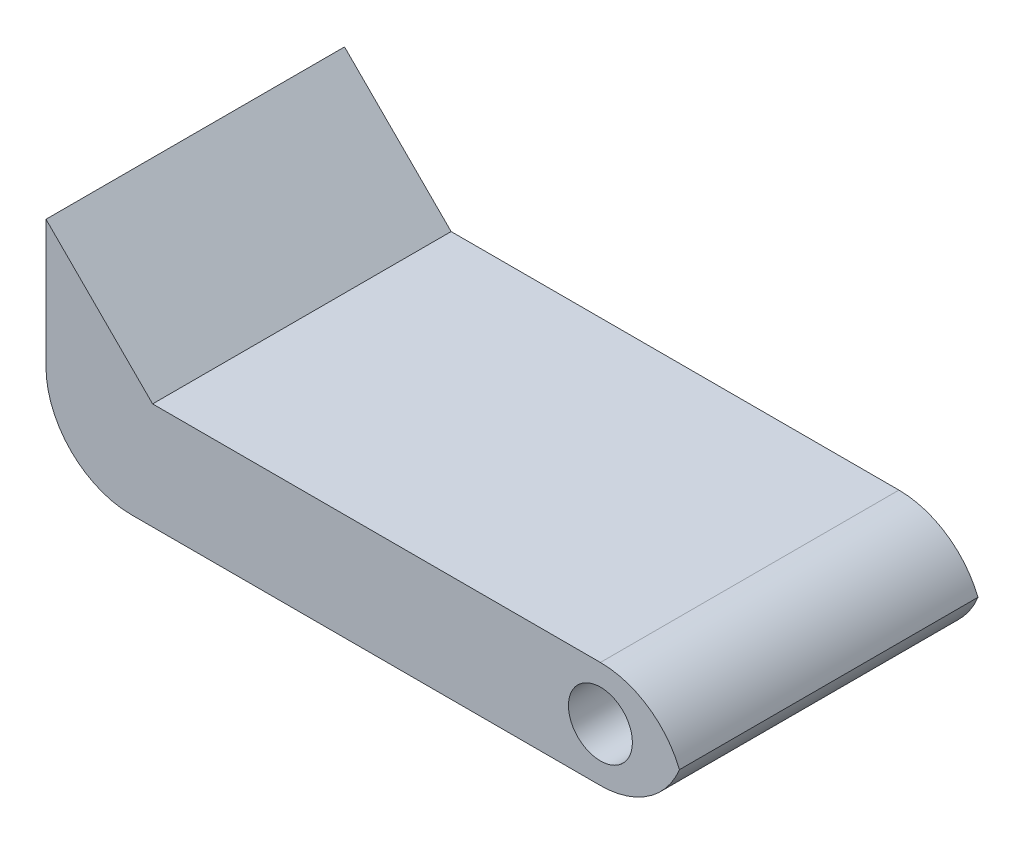
ISO-10303-21;
HEADER;
FILE_DESCRIPTION(('STEP AP214'),'2;1');
FILE_NAME('part.step','',(''),(''),'','','');
FILE_SCHEMA(('AUTOMOTIVE_DESIGN { 1 0 10303 214 1 1 1 1 }'));
ENDSEC;
DATA;
#1=APPLICATION_CONTEXT('core data for automotive mechanical design processes');
#2=APPLICATION_PROTOCOL_DEFINITION('international standard','automotive_design',2000,#1);
#3=PRODUCT_CONTEXT('',#1,'mechanical');
#4=PRODUCT('Part','Part','',(#3));
#5=PRODUCT_RELATED_PRODUCT_CATEGORY('part','',(#4));
#6=PRODUCT_DEFINITION_FORMATION('','',#4);
#7=PRODUCT_DEFINITION_CONTEXT('part definition',#1,'design');
#8=PRODUCT_DEFINITION('design','',#6,#7);
#9=PRODUCT_DEFINITION_SHAPE('','',#8);
#10=(LENGTH_UNIT() NAMED_UNIT(*) SI_UNIT(.MILLI.,.METRE.));
#11=(NAMED_UNIT(*) PLANE_ANGLE_UNIT() SI_UNIT($,.RADIAN.));
#12=(NAMED_UNIT(*) SI_UNIT($,.STERADIAN.) SOLID_ANGLE_UNIT());
#13=UNCERTAINTY_MEASURE_WITH_UNIT(LENGTH_MEASURE(1.E-05),#10,'distance_accuracy_value','');
#14=(GEOMETRIC_REPRESENTATION_CONTEXT(3) GLOBAL_UNCERTAINTY_ASSIGNED_CONTEXT((#13)) GLOBAL_UNIT_ASSIGNED_CONTEXT((#10,
#11,#12)) REPRESENTATION_CONTEXT('',''));
#15=CARTESIAN_POINT('',(0.,0.,0.));
#16=DIRECTION('',(0.,0.,1.));
#17=DIRECTION('',(1.,0.,0.));
#18=AXIS2_PLACEMENT_3D('',#15,#16,#17);
#19=CARTESIAN_POINT('',(0.,0.,17.78));
#20=DIRECTION('',(0.,-1.,0.));
#21=DIRECTION('',(0.,0.,-1.));
#22=AXIS2_PLACEMENT_3D('',#19,#20,#21);
#23=PLANE('',#22);
#24=DIRECTION('',(-1.,0.,0.));
#25=VECTOR('',#24,1.);
#26=CARTESIAN_POINT('',(0.,0.,17.78));
#27=LINE('',#26,#25);
#28=CARTESIAN_POINT('',(-5.08,0.,17.78));
#29=VERTEX_POINT('',#28);
#30=CARTESIAN_POINT('',(-31.75,0.,17.78));
#31=VERTEX_POINT('',#30);
#32=EDGE_CURVE('E103',#29,#31,#27,.T.);
#33=ORIENTED_EDGE('',*,*,#32,.F.);
#34=DIRECTION('',(0.,0.,-1.));
#35=VECTOR('',#34,1.);
#36=CARTESIAN_POINT('',(-5.08,0.,17.78));
#37=LINE('',#36,#35);
#38=CARTESIAN_POINT('',(-5.08,0.,0.));
#39=VERTEX_POINT('',#38);
#40=EDGE_CURVE('E11',#29,#39,#37,.T.);
#41=ORIENTED_EDGE('',*,*,#40,.T.);
#42=DIRECTION('',(-1.,0.,0.));
#43=VECTOR('',#42,1.);
#44=CARTESIAN_POINT('',(0.,0.,0.));
#45=LINE('',#44,#43);
#46=CARTESIAN_POINT('',(-31.75,0.,0.));
#47=VERTEX_POINT('',#46);
#48=EDGE_CURVE('E117',#39,#47,#45,.T.);
#49=ORIENTED_EDGE('',*,*,#48,.T.);
#50=DIRECTION('',(0.,0.,-1.));
#51=VECTOR('',#50,1.);
#52=CARTESIAN_POINT('',(-31.75,0.,17.78));
#53=LINE('',#52,#51);
#54=EDGE_CURVE('E118',#31,#47,#53,.T.);
#55=ORIENTED_EDGE('',*,*,#54,.F.);
#56=EDGE_LOOP('',(#33,#41,#49,#55));
#57=FACE_BOUND('',#56,.T.);
#58=ADVANCED_FACE('F44',(#57),#23,.F.);
#59=CARTESIAN_POINT('',(-31.75,0.,17.78));
#60=DIRECTION('',(-0.707106781186547,-0.707106781186548,0.));
#61=DIRECTION('',(0.707106781186548,-0.707106781186547,0.));
#62=AXIS2_PLACEMENT_3D('',#59,#60,#61);
#63=PLANE('',#62);
#64=DIRECTION('',(-0.707106781186548,0.707106781186547,0.));
#65=VECTOR('',#64,1.);
#66=CARTESIAN_POINT('',(-31.75,0.,0.));
#67=LINE('',#66,#65);
#68=CARTESIAN_POINT('',(-38.1,6.35,0.));
#69=VERTEX_POINT('',#68);
#70=EDGE_CURVE('E139',#47,#69,#67,.T.);
#71=ORIENTED_EDGE('',*,*,#70,.T.);
#72=DIRECTION('',(0.,0.,-1.));
#73=VECTOR('',#72,1.);
#74=CARTESIAN_POINT('',(-38.1,6.35,17.78));
#75=LINE('',#74,#73);
#76=CARTESIAN_POINT('',(-38.1,6.35,17.78));
#77=VERTEX_POINT('',#76);
#78=EDGE_CURVE('E123',#77,#69,#75,.T.);
#79=ORIENTED_EDGE('',*,*,#78,.F.);
#80=DIRECTION('',(-0.707106781186548,0.707106781186547,0.));
#81=VECTOR('',#80,1.);
#82=CARTESIAN_POINT('',(-31.75,0.,17.78));
#83=LINE('',#82,#81);
#84=EDGE_CURVE('E107',#31,#77,#83,.T.);
#85=ORIENTED_EDGE('',*,*,#84,.F.);
#86=ORIENTED_EDGE('',*,*,#54,.T.);
#87=EDGE_LOOP('',(#71,#79,#85,#86));
#88=FACE_BOUND('',#87,.T.);
#89=ADVANCED_FACE('F124',(#88),#63,.F.);
#90=CARTESIAN_POINT('',(-38.1,6.35,17.78));
#91=DIRECTION('',(1.,0.,0.));
#92=DIRECTION('',(0.,0.,-1.));
#93=AXIS2_PLACEMENT_3D('',#90,#91,#92);
#94=PLANE('',#93);
#95=DIRECTION('',(0.,-1.,0.));
#96=VECTOR('',#95,1.);
#97=CARTESIAN_POINT('',(-38.1,6.35,0.));
#98=LINE('',#97,#96);
#99=CARTESIAN_POINT('',(-38.1,-1.27,0.));
#100=VERTEX_POINT('',#99);
#101=EDGE_CURVE('E141',#69,#100,#98,.T.);
#102=ORIENTED_EDGE('',*,*,#101,.T.);
#103=DIRECTION('',(0.,0.,-1.));
#104=VECTOR('',#103,1.);
#105=CARTESIAN_POINT('',(-38.1,-1.27,17.78));
#106=LINE('',#105,#104);
#107=CARTESIAN_POINT('',(-38.1,-1.27,17.78));
#108=VERTEX_POINT('',#107);
#109=EDGE_CURVE('E170',#100,#108,#106,.F.);
#110=ORIENTED_EDGE('',*,*,#109,.T.);
#111=DIRECTION('',(0.,-1.,0.));
#112=VECTOR('',#111,1.);
#113=CARTESIAN_POINT('',(-38.1,6.35,17.78));
#114=LINE('',#113,#112);
#115=EDGE_CURVE('E129',#77,#108,#114,.T.);
#116=ORIENTED_EDGE('',*,*,#115,.F.);
#117=ORIENTED_EDGE('',*,*,#78,.T.);
#118=EDGE_LOOP('',(#102,#110,#116,#117));
#119=FACE_BOUND('',#118,.T.);
#120=ADVANCED_FACE('F190',(#119),#94,.F.);
#121=CARTESIAN_POINT('',(-38.1,-6.35,17.78));
#122=DIRECTION('',(0.,1.,0.));
#123=DIRECTION('',(-1.,0.,0.));
#124=AXIS2_PLACEMENT_3D('',#121,#122,#123);
#125=PLANE('',#124);
#126=DIRECTION('',(1.,0.,0.));
#127=VECTOR('',#126,1.);
#128=CARTESIAN_POINT('',(-38.1,-6.35,17.78));
#129=LINE('',#128,#127);
#130=CARTESIAN_POINT('',(-33.02,-6.35,17.78));
#131=VERTEX_POINT('',#130);
#132=CARTESIAN_POINT('',(-5.08000000000002,-6.35,17.78));
#133=VERTEX_POINT('',#132);
#134=EDGE_CURVE('E134',#131,#133,#129,.T.);
#135=ORIENTED_EDGE('',*,*,#134,.F.);
#136=DIRECTION('',(0.,0.,-1.));
#137=VECTOR('',#136,1.);
#138=CARTESIAN_POINT('',(-33.02,-6.35,17.78));
#139=LINE('',#138,#137);
#140=CARTESIAN_POINT('',(-33.02,-6.35,0.));
#141=VERTEX_POINT('',#140);
#142=EDGE_CURVE('E152',#131,#141,#139,.T.);
#143=ORIENTED_EDGE('',*,*,#142,.T.);
#144=DIRECTION('',(1.,0.,0.));
#145=VECTOR('',#144,1.);
#146=CARTESIAN_POINT('',(-38.1,-6.35,0.));
#147=LINE('',#146,#145);
#148=CARTESIAN_POINT('',(-5.08000000000002,-6.35,0.));
#149=VERTEX_POINT('',#148);
#150=EDGE_CURVE('E114',#141,#149,#147,.T.);
#151=ORIENTED_EDGE('',*,*,#150,.T.);
#152=DIRECTION('',(0.,0.,-1.));
#153=VECTOR('',#152,1.);
#154=CARTESIAN_POINT('',(-5.08,-6.35,17.78));
#155=LINE('',#154,#153);
#156=EDGE_CURVE('E125',#149,#133,#155,.F.);
#157=ORIENTED_EDGE('',*,*,#156,.T.);
#158=EDGE_LOOP('',(#135,#143,#151,#157));
#159=FACE_BOUND('',#158,.T.);
#160=ADVANCED_FACE('F182',(#159),#125,.F.);
#161=CARTESIAN_POINT('',(0.,0.,17.78));
#162=DIRECTION('',(0.,0.,1.));
#163=DIRECTION('',(1.,0.,0.));
#164=AXIS2_PLACEMENT_3D('',#161,#162,#163);
#165=PLANE('',#164);
#166=CARTESIAN_POINT('',(-5.08,-3.175,17.78));
#167=DIRECTION('',(0.,0.,1.));
#168=DIRECTION('',(1.,0.,0.));
#169=AXIS2_PLACEMENT_3D('',#166,#167,#168);
#170=CIRCLE('',#169,1.905);
#171=CARTESIAN_POINT('',(-3.175,-3.175,17.78));
#172=VERTEX_POINT('',#171);
#173=EDGE_CURVE('E225',#172,#172,#170,.T.);
#174=ORIENTED_EDGE('',*,*,#173,.F.);
#175=EDGE_LOOP('',(#174));
#176=FACE_BOUND('',#175,.T.);
#177=ORIENTED_EDGE('',*,*,#115,.T.);
#178=CARTESIAN_POINT('',(-33.02,-1.27,17.78));
#179=DIRECTION('',(0.,0.,1.));
#180=DIRECTION('',(1.,0.,0.));
#181=AXIS2_PLACEMENT_3D('',#178,#179,#180);
#182=CIRCLE('',#181,5.08);
#183=EDGE_CURVE('E54',#108,#131,#182,.T.);
#184=ORIENTED_EDGE('',*,*,#183,.T.);
#185=ORIENTED_EDGE('',*,*,#134,.T.);
#186=CARTESIAN_POINT('',(-5.08,-1.27,17.78));
#187=DIRECTION('',(0.,0.,1.));
#188=DIRECTION('',(1.,0.,0.));
#189=AXIS2_PLACEMENT_3D('',#186,#187,#188);
#190=CIRCLE('',#189,5.08);
#191=CARTESIAN_POINT('',(-0.370713960694255,-3.175,17.78));
#192=VERTEX_POINT('',#191);
#193=EDGE_CURVE('E64',#133,#192,#190,.T.);
#194=ORIENTED_EDGE('',*,*,#193,.T.);
#195=CARTESIAN_POINT('',(-5.08,-5.08,17.78));
#196=DIRECTION('',(0.,0.,1.));
#197=DIRECTION('',(1.,0.,0.));
#198=AXIS2_PLACEMENT_3D('',#195,#196,#197);
#199=CIRCLE('',#198,5.08);
#200=EDGE_CURVE('E70',#192,#29,#199,.T.);
#201=ORIENTED_EDGE('',*,*,#200,.T.);
#202=ORIENTED_EDGE('',*,*,#32,.T.);
#203=ORIENTED_EDGE('',*,*,#84,.T.);
#204=EDGE_LOOP('',(#177,#184,#185,#194,#201,#202,#203));
#205=FACE_BOUND('',#204,.T.);
#206=ADVANCED_FACE('F106',(#176,#205),#165,.T.);
#207=CARTESIAN_POINT('',(0.,0.,0.));
#208=DIRECTION('',(0.,0.,1.));
#209=DIRECTION('',(1.,0.,0.));
#210=AXIS2_PLACEMENT_3D('',#207,#208,#209);
#211=PLANE('',#210);
#212=CARTESIAN_POINT('',(-5.08,-3.175,0.));
#213=DIRECTION('',(0.,0.,1.));
#214=DIRECTION('',(1.,0.,0.));
#215=AXIS2_PLACEMENT_3D('',#212,#213,#214);
#216=CIRCLE('',#215,1.905);
#217=CARTESIAN_POINT('',(-3.175,-3.175,0.));
#218=VERTEX_POINT('',#217);
#219=EDGE_CURVE('E218',#218,#218,#216,.T.);
#220=ORIENTED_EDGE('',*,*,#219,.T.);
#221=EDGE_LOOP('',(#220));
#222=FACE_BOUND('',#221,.T.);
#223=ORIENTED_EDGE('',*,*,#150,.F.);
#224=CARTESIAN_POINT('',(-33.02,-1.27,0.));
#225=DIRECTION('',(0.,0.,1.));
#226=DIRECTION('',(1.,0.,0.));
#227=AXIS2_PLACEMENT_3D('',#224,#225,#226);
#228=CIRCLE('',#227,5.08);
#229=EDGE_CURVE('E163',#141,#100,#228,.F.);
#230=ORIENTED_EDGE('',*,*,#229,.T.);
#231=ORIENTED_EDGE('',*,*,#101,.F.);
#232=ORIENTED_EDGE('',*,*,#70,.F.);
#233=ORIENTED_EDGE('',*,*,#48,.F.);
#234=CARTESIAN_POINT('',(-5.08,-5.08,0.));
#235=DIRECTION('',(0.,0.,1.));
#236=DIRECTION('',(1.,0.,0.));
#237=AXIS2_PLACEMENT_3D('',#234,#235,#236);
#238=CIRCLE('',#237,5.08);
#239=CARTESIAN_POINT('',(-0.370713960694255,-3.175,0.));
#240=VERTEX_POINT('',#239);
#241=EDGE_CURVE('E161',#39,#240,#238,.F.);
#242=ORIENTED_EDGE('',*,*,#241,.T.);
#243=CARTESIAN_POINT('',(-5.08,-1.27,0.));
#244=DIRECTION('',(0.,0.,1.));
#245=DIRECTION('',(1.,0.,0.));
#246=AXIS2_PLACEMENT_3D('',#243,#244,#245);
#247=CIRCLE('',#246,5.08);
#248=EDGE_CURVE('E158',#240,#149,#247,.F.);
#249=ORIENTED_EDGE('',*,*,#248,.T.);
#250=EDGE_LOOP('',(#223,#230,#231,#232,#233,#242,#249));
#251=FACE_BOUND('',#250,.T.);
#252=ADVANCED_FACE('F189',(#222,#251),#211,.F.);
#253=CARTESIAN_POINT('',(-33.02,-1.27,17.78));
#254=DIRECTION('',(0.,0.,-1.));
#255=DIRECTION('',(-1.,0.,0.));
#256=AXIS2_PLACEMENT_3D('',#253,#254,#255);
#257=CYLINDRICAL_SURFACE('',#256,5.08);
#258=ORIENTED_EDGE('',*,*,#183,.F.);
#259=ORIENTED_EDGE('',*,*,#109,.F.);
#260=ORIENTED_EDGE('',*,*,#229,.F.);
#261=ORIENTED_EDGE('',*,*,#142,.F.);
#262=EDGE_LOOP('',(#258,#259,#260,#261));
#263=FACE_BOUND('',#262,.T.);
#264=ADVANCED_FACE('F184',(#263),#257,.T.);
#265=CARTESIAN_POINT('',(-5.08,-1.27,17.78));
#266=DIRECTION('',(0.,0.,-1.));
#267=DIRECTION('',(-1.,0.,0.));
#268=AXIS2_PLACEMENT_3D('',#265,#266,#267);
#269=CYLINDRICAL_SURFACE('',#268,5.08);
#270=DIRECTION('',(0.,0.,-1.));
#271=VECTOR('',#270,1.);
#272=CARTESIAN_POINT('',(-0.370713960694254,-3.175,8.89));
#273=LINE('',#272,#271);
#274=EDGE_CURVE('E47',#192,#240,#273,.T.);
#275=ORIENTED_EDGE('',*,*,#274,.F.);
#276=ORIENTED_EDGE('',*,*,#193,.F.);
#277=ORIENTED_EDGE('',*,*,#156,.F.);
#278=ORIENTED_EDGE('',*,*,#248,.F.);
#279=EDGE_LOOP('',(#275,#276,#277,#278));
#280=FACE_BOUND('',#279,.T.);
#281=ADVANCED_FACE('F50',(#280),#269,.T.);
#282=CARTESIAN_POINT('',(-5.08,-5.08,17.78));
#283=DIRECTION('',(0.,0.,-1.));
#284=DIRECTION('',(-1.,0.,0.));
#285=AXIS2_PLACEMENT_3D('',#282,#283,#284);
#286=CYLINDRICAL_SURFACE('',#285,5.08);
#287=ORIENTED_EDGE('',*,*,#200,.F.);
#288=ORIENTED_EDGE('',*,*,#274,.T.);
#289=ORIENTED_EDGE('',*,*,#241,.F.);
#290=ORIENTED_EDGE('',*,*,#40,.F.);
#291=EDGE_LOOP('',(#287,#288,#289,#290));
#292=FACE_BOUND('',#291,.T.);
#293=ADVANCED_FACE('F204',(#292),#286,.T.);
#294=CARTESIAN_POINT('',(-5.08,-3.175,0.));
#295=DIRECTION('',(0.,0.,1.));
#296=DIRECTION('',(1.,0.,0.));
#297=AXIS2_PLACEMENT_3D('',#294,#295,#296);
#298=CYLINDRICAL_SURFACE('',#297,1.905);
#299=ORIENTED_EDGE('',*,*,#219,.F.);
#300=EDGE_LOOP('',(#299));
#301=FACE_BOUND('',#300,.T.);
#302=ORIENTED_EDGE('',*,*,#173,.T.);
#303=EDGE_LOOP('',(#302));
#304=FACE_BOUND('',#303,.T.);
#305=ADVANCED_FACE('F206',(#301,#304),#298,.F.);
#306=CLOSED_SHELL('',(#58,#89,#120,#160,#206,#252,#264,#281,#293,#305));
#307=MANIFOLD_SOLID_BREP('B2',#306);
#308=ADVANCED_BREP_SHAPE_REPRESENTATION('',(#18,#307),#14);
#309=SHAPE_DEFINITION_REPRESENTATION(#9,#308);
ENDSEC;
END-ISO-10303-21;
